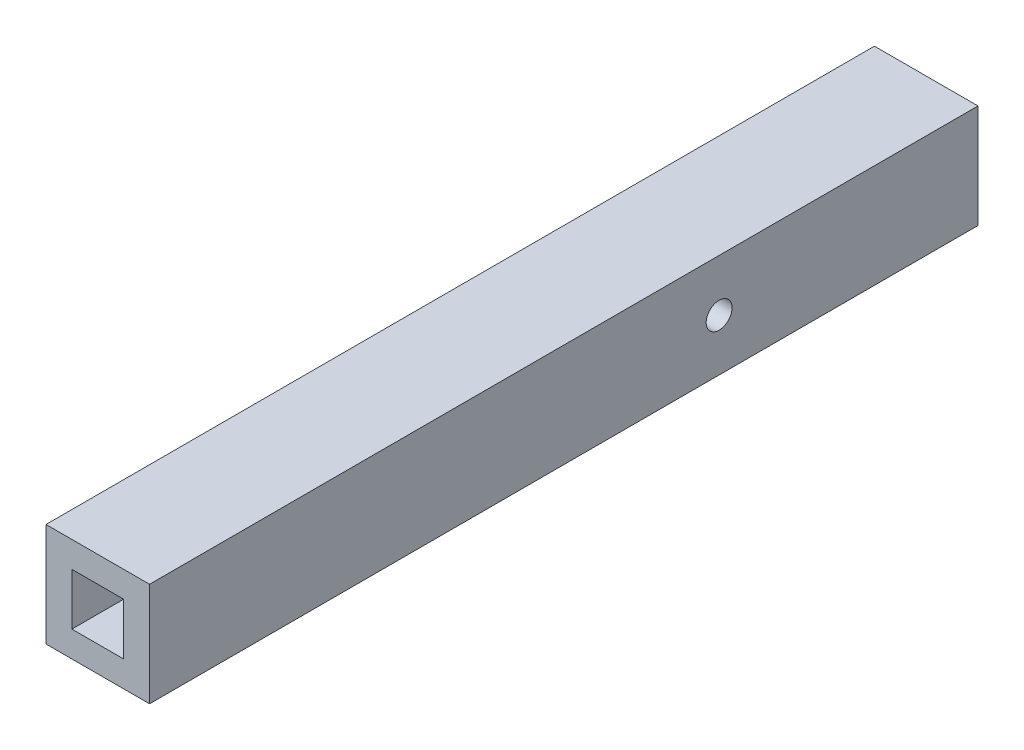
ISO-10303-21;
HEADER;
FILE_DESCRIPTION(('STEP AP214'),'2;1');
FILE_NAME('part.step','',(''),(''),'','','');
FILE_SCHEMA(('AUTOMOTIVE_DESIGN { 1 0 10303 214 1 1 1 1 }'));
ENDSEC;
DATA;
#1=APPLICATION_CONTEXT('core data for automotive mechanical design processes');
#2=APPLICATION_PROTOCOL_DEFINITION('international standard','automotive_design',2000,#1);
#3=PRODUCT_CONTEXT('',#1,'mechanical');
#4=PRODUCT('Part','Part','',(#3));
#5=PRODUCT_RELATED_PRODUCT_CATEGORY('part','',(#4));
#6=PRODUCT_DEFINITION_FORMATION('','',#4);
#7=PRODUCT_DEFINITION_CONTEXT('part definition',#1,'design');
#8=PRODUCT_DEFINITION('design','',#6,#7);
#9=PRODUCT_DEFINITION_SHAPE('','',#8);
#10=(LENGTH_UNIT() NAMED_UNIT(*) SI_UNIT(.MILLI.,.METRE.));
#11=(NAMED_UNIT(*) PLANE_ANGLE_UNIT() SI_UNIT($,.RADIAN.));
#12=(NAMED_UNIT(*) SI_UNIT($,.STERADIAN.) SOLID_ANGLE_UNIT());
#13=UNCERTAINTY_MEASURE_WITH_UNIT(LENGTH_MEASURE(1.E-05),#10,'distance_accuracy_value','');
#14=(GEOMETRIC_REPRESENTATION_CONTEXT(3) GLOBAL_UNCERTAINTY_ASSIGNED_CONTEXT((#13)) GLOBAL_UNIT_ASSIGNED_CONTEXT((#10,
#11,#12)) REPRESENTATION_CONTEXT('',''));
#15=CARTESIAN_POINT('',(0.,0.,0.));
#16=DIRECTION('',(0.,0.,1.));
#17=DIRECTION('',(1.,0.,0.));
#18=AXIS2_PLACEMENT_3D('',#15,#16,#17);
#19=CARTESIAN_POINT('',(-25.4,12.7,63.5));
#20=DIRECTION('',(1.,0.,0.));
#21=DIRECTION('',(0.,1.,0.));
#22=AXIS2_PLACEMENT_3D('',#19,#20,#21);
#23=CYLINDRICAL_SURFACE('',#22,3.175);
#24=CARTESIAN_POINT('',(-6.35,12.7,63.5));
#25=DIRECTION('',(1.,0.,0.));
#26=DIRECTION('',(0.,1.,0.));
#27=AXIS2_PLACEMENT_3D('',#24,#25,#26);
#28=CIRCLE('',#27,3.175);
#29=CARTESIAN_POINT('',(-6.35,15.875,63.5));
#30=VERTEX_POINT('',#29);
#31=EDGE_CURVE('E43',#30,#30,#28,.F.);
#32=ORIENTED_EDGE('',*,*,#31,.T.);
#33=EDGE_LOOP('',(#32));
#34=FACE_BOUND('',#33,.T.);
#35=CARTESIAN_POINT('',(0.,12.7,63.5));
#36=DIRECTION('',(1.,0.,0.));
#37=DIRECTION('',(0.,1.,0.));
#38=AXIS2_PLACEMENT_3D('',#35,#36,#37);
#39=CIRCLE('',#38,3.175);
#40=CARTESIAN_POINT('',(0.,15.875,63.5));
#41=VERTEX_POINT('',#40);
#42=EDGE_CURVE('E162',#41,#41,#39,.T.);
#43=ORIENTED_EDGE('',*,*,#42,.T.);
#44=EDGE_LOOP('',(#43));
#45=FACE_BOUND('',#44,.T.);
#46=ADVANCED_FACE('F39',(#34,#45),#23,.F.);
#47=CARTESIAN_POINT('',(0.,0.,203.2));
#48=DIRECTION('',(-1.,0.,0.));
#49=DIRECTION('',(0.,-1.,0.));
#50=AXIS2_PLACEMENT_3D('',#47,#48,#49);
#51=PLANE('',#50);
#52=ORIENTED_EDGE('',*,*,#42,.F.);
#53=EDGE_LOOP('',(#52));
#54=FACE_BOUND('',#53,.T.);
#55=DIRECTION('',(0.,1.,0.));
#56=VECTOR('',#55,1.);
#57=CARTESIAN_POINT('',(0.,0.,0.));
#58=LINE('',#57,#56);
#59=CARTESIAN_POINT('',(0.,0.,0.));
#60=VERTEX_POINT('',#59);
#61=CARTESIAN_POINT('',(0.,25.4,0.));
#62=VERTEX_POINT('',#61);
#63=EDGE_CURVE('E161',#60,#62,#58,.T.);
#64=ORIENTED_EDGE('',*,*,#63,.T.);
#65=DIRECTION('',(0.,0.,-1.));
#66=VECTOR('',#65,1.);
#67=CARTESIAN_POINT('',(0.,25.4,203.2));
#68=LINE('',#67,#66);
#69=CARTESIAN_POINT('',(0.,25.4,203.2));
#70=VERTEX_POINT('',#69);
#71=EDGE_CURVE('E11',#70,#62,#68,.T.);
#72=ORIENTED_EDGE('',*,*,#71,.F.);
#73=DIRECTION('',(0.,1.,0.));
#74=VECTOR('',#73,1.);
#75=CARTESIAN_POINT('',(0.,0.,203.2));
#76=LINE('',#75,#74);
#77=CARTESIAN_POINT('',(0.,0.,203.2));
#78=VERTEX_POINT('',#77);
#79=EDGE_CURVE('E166',#78,#70,#76,.T.);
#80=ORIENTED_EDGE('',*,*,#79,.F.);
#81=DIRECTION('',(0.,0.,-1.));
#82=VECTOR('',#81,1.);
#83=CARTESIAN_POINT('',(0.,0.,203.2));
#84=LINE('',#83,#82);
#85=EDGE_CURVE('E180',#78,#60,#84,.T.);
#86=ORIENTED_EDGE('',*,*,#85,.T.);
#87=EDGE_LOOP('',(#64,#72,#80,#86));
#88=FACE_BOUND('',#87,.T.);
#89=ADVANCED_FACE('F41',(#54,#88),#51,.F.);
#90=CARTESIAN_POINT('',(0.,25.4,203.2));
#91=DIRECTION('',(0.,-1.,0.));
#92=DIRECTION('',(1.,0.,0.));
#93=AXIS2_PLACEMENT_3D('',#90,#91,#92);
#94=PLANE('',#93);
#95=DIRECTION('',(-1.,0.,0.));
#96=VECTOR('',#95,1.);
#97=CARTESIAN_POINT('',(0.,25.4,0.));
#98=LINE('',#97,#96);
#99=CARTESIAN_POINT('',(-25.4,25.4,0.));
#100=VERTEX_POINT('',#99);
#101=EDGE_CURVE('E184',#62,#100,#98,.T.);
#102=ORIENTED_EDGE('',*,*,#101,.T.);
#103=DIRECTION('',(0.,0.,-1.));
#104=VECTOR('',#103,1.);
#105=CARTESIAN_POINT('',(-25.4,25.4,203.2));
#106=LINE('',#105,#104);
#107=CARTESIAN_POINT('',(-25.4,25.4,203.2));
#108=VERTEX_POINT('',#107);
#109=EDGE_CURVE('E49',#108,#100,#106,.T.);
#110=ORIENTED_EDGE('',*,*,#109,.F.);
#111=DIRECTION('',(-1.,0.,0.));
#112=VECTOR('',#111,1.);
#113=CARTESIAN_POINT('',(0.,25.4,203.2));
#114=LINE('',#113,#112);
#115=EDGE_CURVE('E170',#70,#108,#114,.T.);
#116=ORIENTED_EDGE('',*,*,#115,.F.);
#117=ORIENTED_EDGE('',*,*,#71,.T.);
#118=EDGE_LOOP('',(#102,#110,#116,#117));
#119=FACE_BOUND('',#118,.T.);
#120=ADVANCED_FACE('F227',(#119),#94,.F.);
#121=CARTESIAN_POINT('',(-25.4,0.,203.2));
#122=DIRECTION('',(1.,0.,0.));
#123=DIRECTION('',(0.,0.,-1.));
#124=AXIS2_PLACEMENT_3D('',#121,#122,#123);
#125=PLANE('',#124);
#126=CARTESIAN_POINT('',(-25.4,12.7,63.5));
#127=DIRECTION('',(1.,0.,0.));
#128=DIRECTION('',(0.,1.,0.));
#129=AXIS2_PLACEMENT_3D('',#126,#127,#128);
#130=CIRCLE('',#129,3.175);
#131=CARTESIAN_POINT('',(-25.4,15.875,63.5));
#132=VERTEX_POINT('',#131);
#133=EDGE_CURVE('E157',#132,#132,#130,.T.);
#134=ORIENTED_EDGE('',*,*,#133,.T.);
#135=EDGE_LOOP('',(#134));
#136=FACE_BOUND('',#135,.T.);
#137=DIRECTION('',(0.,-1.,0.));
#138=VECTOR('',#137,1.);
#139=CARTESIAN_POINT('',(-25.4,0.,0.));
#140=LINE('',#139,#138);
#141=CARTESIAN_POINT('',(-25.4,0.,0.));
#142=VERTEX_POINT('',#141);
#143=EDGE_CURVE('E187',#100,#142,#140,.T.);
#144=ORIENTED_EDGE('',*,*,#143,.T.);
#145=DIRECTION('',(0.,0.,-1.));
#146=VECTOR('',#145,1.);
#147=CARTESIAN_POINT('',(-25.4,0.,203.2));
#148=LINE('',#147,#146);
#149=CARTESIAN_POINT('',(-25.4,0.,203.2));
#150=VERTEX_POINT('',#149);
#151=EDGE_CURVE('E195',#150,#142,#148,.T.);
#152=ORIENTED_EDGE('',*,*,#151,.F.);
#153=DIRECTION('',(0.,-1.,0.));
#154=VECTOR('',#153,1.);
#155=CARTESIAN_POINT('',(-25.4,0.,203.2));
#156=LINE('',#155,#154);
#157=EDGE_CURVE('E174',#108,#150,#156,.T.);
#158=ORIENTED_EDGE('',*,*,#157,.F.);
#159=ORIENTED_EDGE('',*,*,#109,.T.);
#160=EDGE_LOOP('',(#144,#152,#158,#159));
#161=FACE_BOUND('',#160,.T.);
#162=ADVANCED_FACE('F238',(#136,#161),#125,.F.);
#163=CARTESIAN_POINT('',(0.,0.,203.2));
#164=DIRECTION('',(0.,1.,0.));
#165=DIRECTION('',(0.,0.,1.));
#166=AXIS2_PLACEMENT_3D('',#163,#164,#165);
#167=PLANE('',#166);
#168=DIRECTION('',(1.,0.,0.));
#169=VECTOR('',#168,1.);
#170=CARTESIAN_POINT('',(0.,0.,0.));
#171=LINE('',#170,#169);
#172=EDGE_CURVE('E171',#142,#60,#171,.T.);
#173=ORIENTED_EDGE('',*,*,#172,.T.);
#174=ORIENTED_EDGE('',*,*,#85,.F.);
#175=DIRECTION('',(1.,0.,0.));
#176=VECTOR('',#175,1.);
#177=CARTESIAN_POINT('',(0.,0.,203.2));
#178=LINE('',#177,#176);
#179=EDGE_CURVE('E177',#150,#78,#178,.T.);
#180=ORIENTED_EDGE('',*,*,#179,.F.);
#181=ORIENTED_EDGE('',*,*,#151,.T.);
#182=EDGE_LOOP('',(#173,#174,#180,#181));
#183=FACE_BOUND('',#182,.T.);
#184=ADVANCED_FACE('F232',(#183),#167,.F.);
#185=CARTESIAN_POINT('',(0.,0.,203.2));
#186=DIRECTION('',(0.,0.,1.));
#187=DIRECTION('',(1.,0.,0.));
#188=AXIS2_PLACEMENT_3D('',#185,#186,#187);
#189=PLANE('',#188);
#190=DIRECTION('',(0.,-1.,0.));
#191=VECTOR('',#190,1.);
#192=CARTESIAN_POINT('',(-6.35,19.05,203.2));
#193=LINE('',#192,#191);
#194=CARTESIAN_POINT('',(-6.35,19.05,203.2));
#195=VERTEX_POINT('',#194);
#196=CARTESIAN_POINT('',(-6.35,6.35,203.2));
#197=VERTEX_POINT('',#196);
#198=EDGE_CURVE('E110',#195,#197,#193,.T.);
#199=ORIENTED_EDGE('',*,*,#198,.T.);
#200=DIRECTION('',(-1.,0.,0.));
#201=VECTOR('',#200,1.);
#202=CARTESIAN_POINT('',(-6.35,6.35,203.2));
#203=LINE('',#202,#201);
#204=CARTESIAN_POINT('',(-19.05,6.35,203.2));
#205=VERTEX_POINT('',#204);
#206=EDGE_CURVE('E120',#197,#205,#203,.T.);
#207=ORIENTED_EDGE('',*,*,#206,.T.);
#208=DIRECTION('',(0.,1.,0.));
#209=VECTOR('',#208,1.);
#210=CARTESIAN_POINT('',(-19.05,19.05,203.2));
#211=LINE('',#210,#209);
#212=CARTESIAN_POINT('',(-19.05,19.05,203.2));
#213=VERTEX_POINT('',#212);
#214=EDGE_CURVE('E57',#205,#213,#211,.T.);
#215=ORIENTED_EDGE('',*,*,#214,.T.);
#216=DIRECTION('',(1.,0.,0.));
#217=VECTOR('',#216,1.);
#218=CARTESIAN_POINT('',(-6.35,19.05,203.2));
#219=LINE('',#218,#217);
#220=EDGE_CURVE('E117',#213,#195,#219,.T.);
#221=ORIENTED_EDGE('',*,*,#220,.T.);
#222=EDGE_LOOP('',(#199,#207,#215,#221));
#223=FACE_BOUND('',#222,.T.);
#224=ORIENTED_EDGE('',*,*,#79,.T.);
#225=ORIENTED_EDGE('',*,*,#115,.T.);
#226=ORIENTED_EDGE('',*,*,#157,.T.);
#227=ORIENTED_EDGE('',*,*,#179,.T.);
#228=EDGE_LOOP('',(#224,#225,#226,#227));
#229=FACE_BOUND('',#228,.T.);
#230=ADVANCED_FACE('F125',(#223,#229),#189,.T.);
#231=CARTESIAN_POINT('',(0.,0.,0.));
#232=DIRECTION('',(0.,0.,1.));
#233=DIRECTION('',(1.,0.,0.));
#234=AXIS2_PLACEMENT_3D('',#231,#232,#233);
#235=PLANE('',#234);
#236=DIRECTION('',(-1.,0.,0.));
#237=VECTOR('',#236,1.);
#238=CARTESIAN_POINT('',(-6.35,6.35,0.));
#239=LINE('',#238,#237);
#240=CARTESIAN_POINT('',(-6.35,6.35,0.));
#241=VERTEX_POINT('',#240);
#242=CARTESIAN_POINT('',(-19.05,6.35,0.));
#243=VERTEX_POINT('',#242);
#244=EDGE_CURVE('E142',#241,#243,#239,.T.);
#245=ORIENTED_EDGE('',*,*,#244,.F.);
#246=DIRECTION('',(0.,-1.,0.));
#247=VECTOR('',#246,1.);
#248=CARTESIAN_POINT('',(-6.35,19.05,0.));
#249=LINE('',#248,#247);
#250=CARTESIAN_POINT('',(-6.35,19.05,0.));
#251=VERTEX_POINT('',#250);
#252=EDGE_CURVE('E65',#251,#241,#249,.T.);
#253=ORIENTED_EDGE('',*,*,#252,.F.);
#254=DIRECTION('',(1.,0.,0.));
#255=VECTOR('',#254,1.);
#256=CARTESIAN_POINT('',(-6.35,19.05,0.));
#257=LINE('',#256,#255);
#258=CARTESIAN_POINT('',(-19.05,19.05,0.));
#259=VERTEX_POINT('',#258);
#260=EDGE_CURVE('E129',#259,#251,#257,.T.);
#261=ORIENTED_EDGE('',*,*,#260,.F.);
#262=DIRECTION('',(0.,1.,0.));
#263=VECTOR('',#262,1.);
#264=CARTESIAN_POINT('',(-19.05,19.05,0.));
#265=LINE('',#264,#263);
#266=EDGE_CURVE('E133',#243,#259,#265,.T.);
#267=ORIENTED_EDGE('',*,*,#266,.F.);
#268=EDGE_LOOP('',(#245,#253,#261,#267));
#269=FACE_BOUND('',#268,.T.);
#270=ORIENTED_EDGE('',*,*,#63,.F.);
#271=ORIENTED_EDGE('',*,*,#172,.F.);
#272=ORIENTED_EDGE('',*,*,#143,.F.);
#273=ORIENTED_EDGE('',*,*,#101,.F.);
#274=EDGE_LOOP('',(#270,#271,#272,#273));
#275=FACE_BOUND('',#274,.T.);
#276=ADVANCED_FACE('F220',(#269,#275),#235,.F.);
#277=CARTESIAN_POINT('',(-19.05,12.7,63.5));
#278=DIRECTION('',(-1.,0.,0.));
#279=DIRECTION('',(0.,0.,1.));
#280=AXIS2_PLACEMENT_3D('',#277,#278,#279);
#281=CIRCLE('',#280,3.175);
#282=CARTESIAN_POINT('',(-19.05,12.7,66.675));
#283=VERTEX_POINT('',#282);
#284=EDGE_CURVE('E151',#283,#283,#281,.F.);
#285=ORIENTED_EDGE('',*,*,#284,.T.);
#286=EDGE_LOOP('',(#285));
#287=FACE_BOUND('',#286,.T.);
#288=ORIENTED_EDGE('',*,*,#133,.F.);
#289=EDGE_LOOP('',(#288));
#290=FACE_BOUND('',#289,.T.);
#291=ADVANCED_FACE('F212',(#287,#290),#23,.F.);
#292=CARTESIAN_POINT('',(-6.35,19.05,203.2));
#293=DIRECTION('',(1.,0.,0.));
#294=DIRECTION('',(0.,1.,0.));
#295=AXIS2_PLACEMENT_3D('',#292,#293,#294);
#296=PLANE('',#295);
#297=ORIENTED_EDGE('',*,*,#252,.T.);
#298=DIRECTION('',(0.,0.,-1.));
#299=VECTOR('',#298,1.);
#300=CARTESIAN_POINT('',(-6.35,6.35,203.2));
#301=LINE('',#300,#299);
#302=EDGE_CURVE('E105',#197,#241,#301,.T.);
#303=ORIENTED_EDGE('',*,*,#302,.F.);
#304=ORIENTED_EDGE('',*,*,#198,.F.);
#305=DIRECTION('',(0.,0.,-1.));
#306=VECTOR('',#305,1.);
#307=CARTESIAN_POINT('',(-6.35,19.05,203.2));
#308=LINE('',#307,#306);
#309=EDGE_CURVE('E148',#195,#251,#308,.T.);
#310=ORIENTED_EDGE('',*,*,#309,.T.);
#311=EDGE_LOOP('',(#297,#303,#304,#310));
#312=FACE_BOUND('',#311,.T.);
#313=ORIENTED_EDGE('',*,*,#31,.F.);
#314=EDGE_LOOP('',(#313));
#315=FACE_BOUND('',#314,.T.);
#316=ADVANCED_FACE('F107',(#312,#315),#296,.F.);
#317=CARTESIAN_POINT('',(-19.05,19.05,203.2));
#318=DIRECTION('',(-1.,0.,0.));
#319=DIRECTION('',(0.,0.,1.));
#320=AXIS2_PLACEMENT_3D('',#317,#318,#319);
#321=PLANE('',#320);
#322=ORIENTED_EDGE('',*,*,#266,.T.);
#323=DIRECTION('',(0.,0.,-1.));
#324=VECTOR('',#323,1.);
#325=CARTESIAN_POINT('',(-19.05,19.05,203.2));
#326=LINE('',#325,#324);
#327=EDGE_CURVE('E152',#213,#259,#326,.T.);
#328=ORIENTED_EDGE('',*,*,#327,.F.);
#329=ORIENTED_EDGE('',*,*,#214,.F.);
#330=DIRECTION('',(0.,0.,-1.));
#331=VECTOR('',#330,1.);
#332=CARTESIAN_POINT('',(-19.05,6.35,203.2));
#333=LINE('',#332,#331);
#334=EDGE_CURVE('E116',#205,#243,#333,.T.);
#335=ORIENTED_EDGE('',*,*,#334,.T.);
#336=EDGE_LOOP('',(#322,#328,#329,#335));
#337=FACE_BOUND('',#336,.T.);
#338=ORIENTED_EDGE('',*,*,#284,.F.);
#339=EDGE_LOOP('',(#338));
#340=FACE_BOUND('',#339,.T.);
#341=ADVANCED_FACE('F211',(#337,#340),#321,.F.);
#342=CARTESIAN_POINT('',(-6.35,19.05,203.2));
#343=DIRECTION('',(0.,1.,0.));
#344=DIRECTION('',(0.,0.,1.));
#345=AXIS2_PLACEMENT_3D('',#342,#343,#344);
#346=PLANE('',#345);
#347=ORIENTED_EDGE('',*,*,#260,.T.);
#348=ORIENTED_EDGE('',*,*,#309,.F.);
#349=ORIENTED_EDGE('',*,*,#220,.F.);
#350=ORIENTED_EDGE('',*,*,#327,.T.);
#351=EDGE_LOOP('',(#347,#348,#349,#350));
#352=FACE_BOUND('',#351,.T.);
#353=ADVANCED_FACE('F218',(#352),#346,.F.);
#354=CARTESIAN_POINT('',(-6.35,6.35,203.2));
#355=DIRECTION('',(0.,-1.,0.));
#356=DIRECTION('',(0.,0.,-1.));
#357=AXIS2_PLACEMENT_3D('',#354,#355,#356);
#358=PLANE('',#357);
#359=ORIENTED_EDGE('',*,*,#244,.T.);
#360=ORIENTED_EDGE('',*,*,#334,.F.);
#361=ORIENTED_EDGE('',*,*,#206,.F.);
#362=ORIENTED_EDGE('',*,*,#302,.T.);
#363=EDGE_LOOP('',(#359,#360,#361,#362));
#364=FACE_BOUND('',#363,.T.);
#365=ADVANCED_FACE('F121',(#364),#358,.F.);
#366=CLOSED_SHELL('',(#46,#89,#120,#162,#184,#230,#276,#291,#316,#341,#353,#365));
#367=MANIFOLD_SOLID_BREP('B2',#366);
#368=ADVANCED_BREP_SHAPE_REPRESENTATION('',(#18,#367),#14);
#369=SHAPE_DEFINITION_REPRESENTATION(#9,#368);
ENDSEC;
END-ISO-10303-21;
